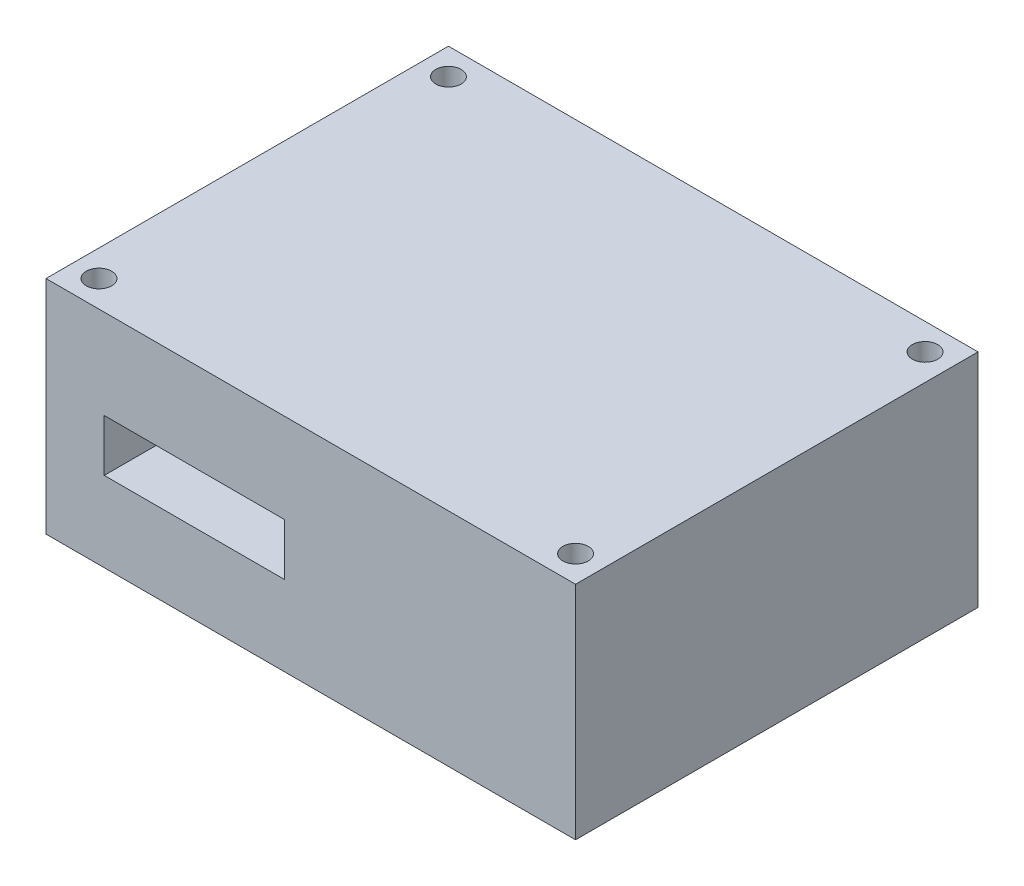
ISO-10303-21;
HEADER;
FILE_DESCRIPTION(('STEP AP214'),'2;1');
FILE_NAME('part.step','',(''),(''),'','','');
FILE_SCHEMA(('AUTOMOTIVE_DESIGN { 1 0 10303 214 1 1 1 1 }'));
ENDSEC;
DATA;
#1=APPLICATION_CONTEXT('core data for automotive mechanical design processes');
#2=APPLICATION_PROTOCOL_DEFINITION('international standard','automotive_design',2000,#1);
#3=PRODUCT_CONTEXT('',#1,'mechanical');
#4=PRODUCT('Part','Part','',(#3));
#5=PRODUCT_RELATED_PRODUCT_CATEGORY('part','',(#4));
#6=PRODUCT_DEFINITION_FORMATION('','',#4);
#7=PRODUCT_DEFINITION_CONTEXT('part definition',#1,'design');
#8=PRODUCT_DEFINITION('design','',#6,#7);
#9=PRODUCT_DEFINITION_SHAPE('','',#8);
#10=(LENGTH_UNIT() NAMED_UNIT(*) SI_UNIT(.MILLI.,.METRE.));
#11=(NAMED_UNIT(*) PLANE_ANGLE_UNIT() SI_UNIT($,.RADIAN.));
#12=(NAMED_UNIT(*) SI_UNIT($,.STERADIAN.) SOLID_ANGLE_UNIT());
#13=UNCERTAINTY_MEASURE_WITH_UNIT(LENGTH_MEASURE(1.E-05),#10,'distance_accuracy_value','');
#14=(GEOMETRIC_REPRESENTATION_CONTEXT(3) GLOBAL_UNCERTAINTY_ASSIGNED_CONTEXT((#13)) GLOBAL_UNIT_ASSIGNED_CONTEXT((#10,
#11,#12)) REPRESENTATION_CONTEXT('',''));
#15=CARTESIAN_POINT('',(0.,0.,0.));
#16=DIRECTION('',(0.,0.,1.));
#17=DIRECTION('',(1.,0.,0.));
#18=AXIS2_PLACEMENT_3D('',#15,#16,#17);
#19=CARTESIAN_POINT('',(-26.2584269662921,20.9,-16.1179775280899));
#20=DIRECTION('',(1.,0.,0.));
#21=DIRECTION('',(0.,0.,-1.));
#22=AXIS2_PLACEMENT_3D('',#19,#20,#21);
#23=PLANE('',#22);
#24=DIRECTION('',(0.,0.,1.));
#25=VECTOR('',#24,1.);
#26=CARTESIAN_POINT('',(-26.2584269662921,0.,-16.1179775280899));
#27=LINE('',#26,#25);
#28=CARTESIAN_POINT('',(-26.2584269662921,0.,-16.1179775280899));
#29=VERTEX_POINT('',#28);
#30=CARTESIAN_POINT('',(-26.2584269662921,0.,21.8820224719101));
#31=VERTEX_POINT('',#30);
#32=EDGE_CURVE('E215',#29,#31,#27,.T.);
#33=ORIENTED_EDGE('',*,*,#32,.T.);
#34=DIRECTION('',(0.,-1.,0.));
#35=VECTOR('',#34,1.);
#36=CARTESIAN_POINT('',(-26.2584269662921,20.9,21.8820224719101));
#37=LINE('',#36,#35);
#38=CARTESIAN_POINT('',(-26.2584269662921,20.9,21.8820224719101));
#39=VERTEX_POINT('',#38);
#40=EDGE_CURVE('E11',#39,#31,#37,.T.);
#41=ORIENTED_EDGE('',*,*,#40,.F.);
#42=DIRECTION('',(0.,0.,1.));
#43=VECTOR('',#42,1.);
#44=CARTESIAN_POINT('',(-26.2584269662921,20.9,-16.1179775280899));
#45=LINE('',#44,#43);
#46=CARTESIAN_POINT('',(-26.2584269662921,20.9,-16.1179775280899));
#47=VERTEX_POINT('',#46);
#48=EDGE_CURVE('E216',#47,#39,#45,.T.);
#49=ORIENTED_EDGE('',*,*,#48,.F.);
#50=DIRECTION('',(0.,-1.,0.));
#51=VECTOR('',#50,1.);
#52=CARTESIAN_POINT('',(-26.2584269662921,20.9,-16.1179775280899));
#53=LINE('',#52,#51);
#54=EDGE_CURVE('E222',#47,#29,#53,.T.);
#55=ORIENTED_EDGE('',*,*,#54,.T.);
#56=EDGE_LOOP('',(#33,#41,#49,#55));
#57=FACE_BOUND('',#56,.T.);
#58=ADVANCED_FACE('F32',(#57),#23,.F.);
#59=CARTESIAN_POINT('',(-26.2584269662921,20.9,21.8820224719101));
#60=DIRECTION('',(0.,0.,-1.));
#61=DIRECTION('',(-1.,0.,0.));
#62=AXIS2_PLACEMENT_3D('',#59,#60,#61);
#63=PLANE('',#62);
#64=DIRECTION('',(1.,0.,0.));
#65=VECTOR('',#64,1.);
#66=CARTESIAN_POINT('',(-3.75842696629214,7.55,21.8820224719101));
#67=LINE('',#66,#65);
#68=CARTESIAN_POINT('',(-20.7584269662921,7.55,21.8820224719101));
#69=VERTEX_POINT('',#68);
#70=CARTESIAN_POINT('',(-3.75842696629214,7.55,21.8820224719101));
#71=VERTEX_POINT('',#70);
#72=EDGE_CURVE('E146',#69,#71,#67,.T.);
#73=ORIENTED_EDGE('',*,*,#72,.F.);
#74=DIRECTION('',(0.,-1.,0.));
#75=VECTOR('',#74,1.);
#76=CARTESIAN_POINT('',(-20.7584269662921,7.55,21.8820224719101));
#77=LINE('',#76,#75);
#78=CARTESIAN_POINT('',(-20.7584269662921,12.45,21.8820224719101));
#79=VERTEX_POINT('',#78);
#80=EDGE_CURVE('E46',#79,#69,#77,.T.);
#81=ORIENTED_EDGE('',*,*,#80,.F.);
#82=DIRECTION('',(-1.,0.,0.));
#83=VECTOR('',#82,1.);
#84=CARTESIAN_POINT('',(-3.75842696629214,12.45,21.8820224719101));
#85=LINE('',#84,#83);
#86=CARTESIAN_POINT('',(-3.75842696629214,12.45,21.8820224719101));
#87=VERTEX_POINT('',#86);
#88=EDGE_CURVE('E137',#87,#79,#85,.T.);
#89=ORIENTED_EDGE('',*,*,#88,.F.);
#90=DIRECTION('',(0.,1.,0.));
#91=VECTOR('',#90,1.);
#92=CARTESIAN_POINT('',(-3.75842696629214,7.55,21.8820224719101));
#93=LINE('',#92,#91);
#94=EDGE_CURVE('E140',#71,#87,#93,.T.);
#95=ORIENTED_EDGE('',*,*,#94,.F.);
#96=EDGE_LOOP('',(#73,#81,#89,#95));
#97=FACE_BOUND('',#96,.T.);
#98=DIRECTION('',(1.,0.,0.));
#99=VECTOR('',#98,1.);
#100=CARTESIAN_POINT('',(-26.2584269662921,0.,21.8820224719101));
#101=LINE('',#100,#99);
#102=CARTESIAN_POINT('',(23.7415730337079,0.,21.8820224719101));
#103=VERTEX_POINT('',#102);
#104=EDGE_CURVE('E225',#31,#103,#101,.T.);
#105=ORIENTED_EDGE('',*,*,#104,.T.);
#106=DIRECTION('',(0.,-1.,0.));
#107=VECTOR('',#106,1.);
#108=CARTESIAN_POINT('',(23.7415730337079,20.9,21.8820224719101));
#109=LINE('',#108,#107);
#110=CARTESIAN_POINT('',(23.7415730337079,20.9,21.8820224719101));
#111=VERTEX_POINT('',#110);
#112=EDGE_CURVE('E39',#111,#103,#109,.T.);
#113=ORIENTED_EDGE('',*,*,#112,.F.);
#114=DIRECTION('',(1.,0.,0.));
#115=VECTOR('',#114,1.);
#116=CARTESIAN_POINT('',(-26.2584269662921,20.9,21.8820224719101));
#117=LINE('',#116,#115);
#118=EDGE_CURVE('E83',#39,#111,#117,.T.);
#119=ORIENTED_EDGE('',*,*,#118,.F.);
#120=ORIENTED_EDGE('',*,*,#40,.T.);
#121=EDGE_LOOP('',(#105,#113,#119,#120));
#122=FACE_BOUND('',#121,.T.);
#123=ADVANCED_FACE('F256',(#97,#122),#63,.F.);
#124=CARTESIAN_POINT('',(23.7415730337079,20.9,-16.1179775280899));
#125=DIRECTION('',(-1.,0.,0.));
#126=DIRECTION('',(0.,0.,1.));
#127=AXIS2_PLACEMENT_3D('',#124,#125,#126);
#128=PLANE('',#127);
#129=DIRECTION('',(0.,0.,-1.));
#130=VECTOR('',#129,1.);
#131=CARTESIAN_POINT('',(23.7415730337079,0.,-16.1179775280899));
#132=LINE('',#131,#130);
#133=CARTESIAN_POINT('',(23.7415730337079,0.,-16.1179775280899));
#134=VERTEX_POINT('',#133);
#135=EDGE_CURVE('E227',#103,#134,#132,.T.);
#136=ORIENTED_EDGE('',*,*,#135,.T.);
#137=DIRECTION('',(0.,-1.,0.));
#138=VECTOR('',#137,1.);
#139=CARTESIAN_POINT('',(23.7415730337079,20.9,-16.1179775280899));
#140=LINE('',#139,#138);
#141=CARTESIAN_POINT('',(23.7415730337079,20.9,-16.1179775280899));
#142=VERTEX_POINT('',#141);
#143=EDGE_CURVE('E231',#142,#134,#140,.T.);
#144=ORIENTED_EDGE('',*,*,#143,.F.);
#145=DIRECTION('',(0.,0.,-1.));
#146=VECTOR('',#145,1.);
#147=CARTESIAN_POINT('',(23.7415730337079,20.9,-16.1179775280899));
#148=LINE('',#147,#146);
#149=EDGE_CURVE('E219',#111,#142,#148,.T.);
#150=ORIENTED_EDGE('',*,*,#149,.F.);
#151=ORIENTED_EDGE('',*,*,#112,.T.);
#152=EDGE_LOOP('',(#136,#144,#150,#151));
#153=FACE_BOUND('',#152,.T.);
#154=ADVANCED_FACE('F236',(#153),#128,.F.);
#155=CARTESIAN_POINT('',(-26.2584269662921,20.9,-16.1179775280899));
#156=DIRECTION('',(0.,0.,1.));
#157=DIRECTION('',(1.,0.,0.));
#158=AXIS2_PLACEMENT_3D('',#155,#156,#157);
#159=PLANE('',#158);
#160=CARTESIAN_POINT('',(-20.2584269662921,2.45,-16.1179775280899));
#161=DIRECTION('',(0.,0.,-1.));
#162=DIRECTION('',(-1.,0.,0.));
#163=AXIS2_PLACEMENT_3D('',#160,#161,#162);
#164=CIRCLE('',#163,1.25);
#165=CARTESIAN_POINT('',(-21.5084269662921,2.45,-16.1179775280899));
#166=VERTEX_POINT('',#165);
#167=EDGE_CURVE('E160',#166,#166,#164,.T.);
#168=ORIENTED_EDGE('',*,*,#167,.F.);
#169=EDGE_LOOP('',(#168));
#170=FACE_BOUND('',#169,.T.);
#171=CARTESIAN_POINT('',(-16.2584269662921,2.45,-16.1179775280899));
#172=DIRECTION('',(0.,0.,-1.));
#173=DIRECTION('',(-1.,0.,0.));
#174=AXIS2_PLACEMENT_3D('',#171,#172,#173);
#175=CIRCLE('',#174,1.25);
#176=CARTESIAN_POINT('',(-17.5084269662921,2.45,-16.1179775280899));
#177=VERTEX_POINT('',#176);
#178=EDGE_CURVE('E166',#177,#177,#175,.T.);
#179=ORIENTED_EDGE('',*,*,#178,.F.);
#180=EDGE_LOOP('',(#179));
#181=FACE_BOUND('',#180,.T.);
#182=CARTESIAN_POINT('',(-12.2584269662921,2.45,-16.1179775280899));
#183=DIRECTION('',(0.,0.,-1.));
#184=DIRECTION('',(-1.,0.,0.));
#185=AXIS2_PLACEMENT_3D('',#182,#183,#184);
#186=CIRCLE('',#185,1.25);
#187=CARTESIAN_POINT('',(-13.5084269662921,2.45,-16.1179775280899));
#188=VERTEX_POINT('',#187);
#189=EDGE_CURVE('E172',#188,#188,#186,.T.);
#190=ORIENTED_EDGE('',*,*,#189,.F.);
#191=EDGE_LOOP('',(#190));
#192=FACE_BOUND('',#191,.T.);
#193=CARTESIAN_POINT('',(-8.25842696629214,2.45,-16.1179775280899));
#194=DIRECTION('',(0.,0.,-1.));
#195=DIRECTION('',(-1.,0.,0.));
#196=AXIS2_PLACEMENT_3D('',#193,#194,#195);
#197=CIRCLE('',#196,1.25);
#198=CARTESIAN_POINT('',(-9.50842696629214,2.45,-16.1179775280899));
#199=VERTEX_POINT('',#198);
#200=EDGE_CURVE('E152',#199,#199,#197,.T.);
#201=ORIENTED_EDGE('',*,*,#200,.F.);
#202=EDGE_LOOP('',(#201));
#203=FACE_BOUND('',#202,.T.);
#204=CARTESIAN_POINT('',(9.54157303370786,10.45,-16.1179775280899));
#205=DIRECTION('',(0.,0.,-1.));
#206=DIRECTION('',(-1.,0.,0.));
#207=AXIS2_PLACEMENT_3D('',#204,#205,#206);
#208=CIRCLE('',#207,9.);
#209=CARTESIAN_POINT('',(0.541573033707858,10.45,-16.1179775280899));
#210=VERTEX_POINT('',#209);
#211=EDGE_CURVE('E183',#210,#210,#208,.T.);
#212=ORIENTED_EDGE('',*,*,#211,.F.);
#213=EDGE_LOOP('',(#212));
#214=FACE_BOUND('',#213,.T.);
#215=DIRECTION('',(-1.,0.,0.));
#216=VECTOR('',#215,1.);
#217=CARTESIAN_POINT('',(-26.2584269662921,0.,-16.1179775280899));
#218=LINE('',#217,#216);
#219=EDGE_CURVE('E76',#134,#29,#218,.T.);
#220=ORIENTED_EDGE('',*,*,#219,.T.);
#221=ORIENTED_EDGE('',*,*,#54,.F.);
#222=DIRECTION('',(-1.,0.,0.));
#223=VECTOR('',#222,1.);
#224=CARTESIAN_POINT('',(-26.2584269662921,20.9,-16.1179775280899));
#225=LINE('',#224,#223);
#226=EDGE_CURVE('E55',#142,#47,#225,.T.);
#227=ORIENTED_EDGE('',*,*,#226,.F.);
#228=ORIENTED_EDGE('',*,*,#143,.T.);
#229=EDGE_LOOP('',(#220,#221,#227,#228));
#230=FACE_BOUND('',#229,.T.);
#231=ADVANCED_FACE('F244',(#170,#181,#192,#203,#214,#230),#159,.F.);
#232=CARTESIAN_POINT('',(0.,20.9,0.));
#233=DIRECTION('',(0.,1.,0.));
#234=DIRECTION('',(0.,0.,1.));
#235=AXIS2_PLACEMENT_3D('',#232,#233,#234);
#236=PLANE('',#235);
#237=CARTESIAN_POINT('',(-23.7584269662921,20.9,-13.6179775280899));
#238=DIRECTION('',(0.,1.,0.));
#239=DIRECTION('',(0.,0.,1.));
#240=AXIS2_PLACEMENT_3D('',#237,#238,#239);
#241=CIRCLE('',#240,1.19999999999999);
#242=CARTESIAN_POINT('',(-23.7584269662921,20.9,-12.4179775280899));
#243=VERTEX_POINT('',#242);
#244=EDGE_CURVE('E189',#243,#243,#241,.T.);
#245=ORIENTED_EDGE('',*,*,#244,.F.);
#246=EDGE_LOOP('',(#245));
#247=FACE_BOUND('',#246,.T.);
#248=CARTESIAN_POINT('',(-23.7584269662921,20.9,19.3820224719101));
#249=DIRECTION('',(0.,1.,0.));
#250=DIRECTION('',(0.,0.,1.));
#251=AXIS2_PLACEMENT_3D('',#248,#249,#250);
#252=CIRCLE('',#251,1.19999999999999);
#253=CARTESIAN_POINT('',(-23.7584269662921,20.9,20.5820224719101));
#254=VERTEX_POINT('',#253);
#255=EDGE_CURVE('E197',#254,#254,#252,.T.);
#256=ORIENTED_EDGE('',*,*,#255,.F.);
#257=EDGE_LOOP('',(#256));
#258=FACE_BOUND('',#257,.T.);
#259=CARTESIAN_POINT('',(21.2415730337079,20.9,19.3820224719101));
#260=DIRECTION('',(0.,1.,0.));
#261=DIRECTION('',(0.,0.,1.));
#262=AXIS2_PLACEMENT_3D('',#259,#260,#261);
#263=CIRCLE('',#262,1.19999999999999);
#264=CARTESIAN_POINT('',(21.2415730337079,20.9,20.5820224719101));
#265=VERTEX_POINT('',#264);
#266=EDGE_CURVE('E203',#265,#265,#263,.T.);
#267=ORIENTED_EDGE('',*,*,#266,.F.);
#268=EDGE_LOOP('',(#267));
#269=FACE_BOUND('',#268,.T.);
#270=CARTESIAN_POINT('',(21.2415730337079,20.9,-13.6179775280899));
#271=DIRECTION('',(0.,1.,0.));
#272=DIRECTION('',(0.,0.,1.));
#273=AXIS2_PLACEMENT_3D('',#270,#271,#272);
#274=CIRCLE('',#273,1.19999999999999);
#275=CARTESIAN_POINT('',(21.2415730337079,20.9,-12.4179775280899));
#276=VERTEX_POINT('',#275);
#277=EDGE_CURVE('E209',#276,#276,#274,.T.);
#278=ORIENTED_EDGE('',*,*,#277,.F.);
#279=EDGE_LOOP('',(#278));
#280=FACE_BOUND('',#279,.T.);
#281=ORIENTED_EDGE('',*,*,#48,.T.);
#282=ORIENTED_EDGE('',*,*,#118,.T.);
#283=ORIENTED_EDGE('',*,*,#149,.T.);
#284=ORIENTED_EDGE('',*,*,#226,.T.);
#285=EDGE_LOOP('',(#281,#282,#283,#284));
#286=FACE_BOUND('',#285,.T.);
#287=ADVANCED_FACE('F246',(#247,#258,#269,#280,#286),#236,.T.);
#288=CARTESIAN_POINT('',(0.,0.,0.));
#289=DIRECTION('',(0.,1.,0.));
#290=DIRECTION('',(0.,0.,1.));
#291=AXIS2_PLACEMENT_3D('',#288,#289,#290);
#292=PLANE('',#291);
#293=ORIENTED_EDGE('',*,*,#32,.F.);
#294=ORIENTED_EDGE('',*,*,#219,.F.);
#295=ORIENTED_EDGE('',*,*,#135,.F.);
#296=ORIENTED_EDGE('',*,*,#104,.F.);
#297=EDGE_LOOP('',(#293,#294,#295,#296));
#298=FACE_BOUND('',#297,.T.);
#299=ADVANCED_FACE('F240',(#298),#292,.F.);
#300=CARTESIAN_POINT('',(21.2415730337079,10.9,-13.6179775280899));
#301=DIRECTION('',(0.,1.,0.));
#302=DIRECTION('',(0.,0.,1.));
#303=AXIS2_PLACEMENT_3D('',#300,#301,#302);
#304=CONICAL_SURFACE('',#303,1.2,1.02974425867665);
#305=CARTESIAN_POINT('',(21.2415730337079,10.1789672571669,-13.6179775280899));
#306=VERTEX_POINT('',#305);
#307=VERTEX_LOOP('',#306);
#308=FACE_BOUND('',#307,.T.);
#309=CARTESIAN_POINT('',(21.2415730337079,10.9,-13.6179775280899));
#310=DIRECTION('',(0.,1.,0.));
#311=DIRECTION('',(0.,0.,1.));
#312=AXIS2_PLACEMENT_3D('',#309,#310,#311);
#313=CIRCLE('',#312,1.2);
#314=CARTESIAN_POINT('',(21.2415730337079,10.9,-12.4179775280899));
#315=VERTEX_POINT('',#314);
#316=EDGE_CURVE('E212',#315,#315,#313,.T.);
#317=ORIENTED_EDGE('',*,*,#316,.T.);
#318=EDGE_LOOP('',(#317));
#319=FACE_BOUND('',#318,.T.);
#320=ADVANCED_FACE('F359',(#308,#319),#304,.F.);
#321=CARTESIAN_POINT('',(21.2415730337079,20.9,-13.6179775280899));
#322=DIRECTION('',(0.,1.,0.));
#323=DIRECTION('',(0.,0.,1.));
#324=AXIS2_PLACEMENT_3D('',#321,#322,#323);
#325=CYLINDRICAL_SURFACE('',#324,1.19999999999999);
#326=ORIENTED_EDGE('',*,*,#316,.F.);
#327=EDGE_LOOP('',(#326));
#328=FACE_BOUND('',#327,.T.);
#329=ORIENTED_EDGE('',*,*,#277,.T.);
#330=EDGE_LOOP('',(#329));
#331=FACE_BOUND('',#330,.T.);
#332=ADVANCED_FACE('F355',(#328,#331),#325,.F.);
#333=CARTESIAN_POINT('',(21.2415730337079,10.9,19.3820224719101));
#334=DIRECTION('',(0.,1.,0.));
#335=DIRECTION('',(0.,0.,1.));
#336=AXIS2_PLACEMENT_3D('',#333,#334,#335);
#337=CONICAL_SURFACE('',#336,1.2,1.02974425867665);
#338=CARTESIAN_POINT('',(21.2415730337079,10.1789672571669,19.3820224719101));
#339=VERTEX_POINT('',#338);
#340=VERTEX_LOOP('',#339);
#341=FACE_BOUND('',#340,.T.);
#342=CARTESIAN_POINT('',(21.2415730337079,10.9,19.3820224719101));
#343=DIRECTION('',(0.,1.,0.));
#344=DIRECTION('',(0.,0.,1.));
#345=AXIS2_PLACEMENT_3D('',#342,#343,#344);
#346=CIRCLE('',#345,1.2);
#347=CARTESIAN_POINT('',(21.2415730337079,10.9,20.5820224719101));
#348=VERTEX_POINT('',#347);
#349=EDGE_CURVE('E206',#348,#348,#346,.T.);
#350=ORIENTED_EDGE('',*,*,#349,.T.);
#351=EDGE_LOOP('',(#350));
#352=FACE_BOUND('',#351,.T.);
#353=ADVANCED_FACE('F351',(#341,#352),#337,.F.);
#354=CARTESIAN_POINT('',(21.2415730337079,20.9,19.3820224719101));
#355=DIRECTION('',(0.,1.,0.));
#356=DIRECTION('',(0.,0.,1.));
#357=AXIS2_PLACEMENT_3D('',#354,#355,#356);
#358=CYLINDRICAL_SURFACE('',#357,1.19999999999999);
#359=ORIENTED_EDGE('',*,*,#349,.F.);
#360=EDGE_LOOP('',(#359));
#361=FACE_BOUND('',#360,.T.);
#362=ORIENTED_EDGE('',*,*,#266,.T.);
#363=EDGE_LOOP('',(#362));
#364=FACE_BOUND('',#363,.T.);
#365=ADVANCED_FACE('F347',(#361,#364),#358,.F.);
#366=CARTESIAN_POINT('',(-23.7584269662921,10.9,19.3820224719101));
#367=DIRECTION('',(0.,1.,0.));
#368=DIRECTION('',(0.,0.,1.));
#369=AXIS2_PLACEMENT_3D('',#366,#367,#368);
#370=CONICAL_SURFACE('',#369,1.2,1.02974425867665);
#371=CARTESIAN_POINT('',(-23.7584269662921,10.1789672571669,19.3820224719101));
#372=VERTEX_POINT('',#371);
#373=VERTEX_LOOP('',#372);
#374=FACE_BOUND('',#373,.T.);
#375=CARTESIAN_POINT('',(-23.7584269662921,10.9,19.3820224719101));
#376=DIRECTION('',(0.,1.,0.));
#377=DIRECTION('',(0.,0.,1.));
#378=AXIS2_PLACEMENT_3D('',#375,#376,#377);
#379=CIRCLE('',#378,1.2);
#380=CARTESIAN_POINT('',(-23.7584269662921,10.9,20.5820224719101));
#381=VERTEX_POINT('',#380);
#382=EDGE_CURVE('E200',#381,#381,#379,.T.);
#383=ORIENTED_EDGE('',*,*,#382,.T.);
#384=EDGE_LOOP('',(#383));
#385=FACE_BOUND('',#384,.T.);
#386=ADVANCED_FACE('F343',(#374,#385),#370,.F.);
#387=CARTESIAN_POINT('',(-23.7584269662921,20.9,19.3820224719101));
#388=DIRECTION('',(0.,1.,0.));
#389=DIRECTION('',(0.,0.,1.));
#390=AXIS2_PLACEMENT_3D('',#387,#388,#389);
#391=CYLINDRICAL_SURFACE('',#390,1.19999999999999);
#392=ORIENTED_EDGE('',*,*,#382,.F.);
#393=EDGE_LOOP('',(#392));
#394=FACE_BOUND('',#393,.T.);
#395=ORIENTED_EDGE('',*,*,#255,.T.);
#396=EDGE_LOOP('',(#395));
#397=FACE_BOUND('',#396,.T.);
#398=ADVANCED_FACE('F339',(#394,#397),#391,.F.);
#399=CARTESIAN_POINT('',(-23.7584269662921,10.9,-13.6179775280899));
#400=DIRECTION('',(0.,1.,0.));
#401=DIRECTION('',(0.,0.,1.));
#402=AXIS2_PLACEMENT_3D('',#399,#400,#401);
#403=CONICAL_SURFACE('',#402,1.2,1.02974425867665);
#404=CARTESIAN_POINT('',(-23.7584269662921,10.1789672571669,-13.6179775280899));
#405=VERTEX_POINT('',#404);
#406=VERTEX_LOOP('',#405);
#407=FACE_BOUND('',#406,.T.);
#408=CARTESIAN_POINT('',(-23.7584269662921,10.9,-13.6179775280899));
#409=DIRECTION('',(0.,1.,0.));
#410=DIRECTION('',(0.,0.,1.));
#411=AXIS2_PLACEMENT_3D('',#408,#409,#410);
#412=CIRCLE('',#411,1.2);
#413=CARTESIAN_POINT('',(-23.7584269662921,10.9,-12.4179775280899));
#414=VERTEX_POINT('',#413);
#415=EDGE_CURVE('E194',#414,#414,#412,.T.);
#416=ORIENTED_EDGE('',*,*,#415,.T.);
#417=EDGE_LOOP('',(#416));
#418=FACE_BOUND('',#417,.T.);
#419=ADVANCED_FACE('F335',(#407,#418),#403,.F.);
#420=CARTESIAN_POINT('',(-23.7584269662921,20.9,-13.6179775280899));
#421=DIRECTION('',(0.,1.,0.));
#422=DIRECTION('',(0.,0.,1.));
#423=AXIS2_PLACEMENT_3D('',#420,#421,#422);
#424=CYLINDRICAL_SURFACE('',#423,1.19999999999999);
#425=ORIENTED_EDGE('',*,*,#415,.F.);
#426=EDGE_LOOP('',(#425));
#427=FACE_BOUND('',#426,.T.);
#428=ORIENTED_EDGE('',*,*,#244,.T.);
#429=EDGE_LOOP('',(#428));
#430=FACE_BOUND('',#429,.T.);
#431=ADVANCED_FACE('F331',(#427,#430),#424,.F.);
#432=CARTESIAN_POINT('',(9.54157303370786,10.45,-11.1179775280899));
#433=DIRECTION('',(0.,0.,-1.));
#434=DIRECTION('',(-1.,0.,0.));
#435=AXIS2_PLACEMENT_3D('',#432,#433,#434);
#436=CYLINDRICAL_SURFACE('',#435,9.);
#437=CARTESIAN_POINT('',(9.54157303370786,10.45,-11.1179775280899));
#438=DIRECTION('',(0.,0.,-1.));
#439=DIRECTION('',(-1.,0.,0.));
#440=AXIS2_PLACEMENT_3D('',#437,#438,#439);
#441=CIRCLE('',#440,9.);
#442=CARTESIAN_POINT('',(0.541573033707858,10.45,-11.1179775280899));
#443=VERTEX_POINT('',#442);
#444=EDGE_CURVE('E186',#443,#443,#441,.T.);
#445=ORIENTED_EDGE('',*,*,#444,.F.);
#446=EDGE_LOOP('',(#445));
#447=FACE_BOUND('',#446,.T.);
#448=ORIENTED_EDGE('',*,*,#211,.T.);
#449=EDGE_LOOP('',(#448));
#450=FACE_BOUND('',#449,.T.);
#451=ADVANCED_FACE('F327',(#447,#450),#436,.F.);
#452=CARTESIAN_POINT('',(9.54157303370786,10.45,-11.1179775280899));
#453=DIRECTION('',(0.,0.,-1.));
#454=DIRECTION('',(-1.,0.,0.));
#455=AXIS2_PLACEMENT_3D('',#452,#453,#454);
#456=PLANE('',#455);
#457=CARTESIAN_POINT('',(9.54157303370786,10.45,-11.1179775280899));
#458=DIRECTION('',(0.,0.,-1.));
#459=DIRECTION('',(-1.,0.,0.));
#460=AXIS2_PLACEMENT_3D('',#457,#458,#459);
#461=CIRCLE('',#460,6.);
#462=CARTESIAN_POINT('',(3.54157303370786,10.45,-11.1179775280899));
#463=VERTEX_POINT('',#462);
#464=EDGE_CURVE('E180',#463,#463,#461,.T.);
#465=ORIENTED_EDGE('',*,*,#464,.F.);
#466=EDGE_LOOP('',(#465));
#467=FACE_BOUND('',#466,.T.);
#468=ORIENTED_EDGE('',*,*,#444,.T.);
#469=EDGE_LOOP('',(#468));
#470=FACE_BOUND('',#469,.T.);
#471=ADVANCED_FACE('F323',(#467,#470),#456,.T.);
#472=CARTESIAN_POINT('',(9.54157303370786,10.45,-11.1179775280899));
#473=DIRECTION('',(0.,0.,-1.));
#474=DIRECTION('',(-1.,0.,0.));
#475=AXIS2_PLACEMENT_3D('',#472,#473,#474);
#476=CYLINDRICAL_SURFACE('',#475,6.);
#477=ORIENTED_EDGE('',*,*,#464,.T.);
#478=EDGE_LOOP('',(#477));
#479=FACE_BOUND('',#478,.T.);
#480=CARTESIAN_POINT('',(9.54157303370786,10.45,-16.1179775280899));
#481=DIRECTION('',(0.,0.,-1.));
#482=DIRECTION('',(-1.,0.,0.));
#483=AXIS2_PLACEMENT_3D('',#480,#481,#482);
#484=CIRCLE('',#483,6.);
#485=CARTESIAN_POINT('',(3.54157303370786,10.45,-16.1179775280899));
#486=VERTEX_POINT('',#485);
#487=EDGE_CURVE('E159',#486,#486,#484,.T.);
#488=ORIENTED_EDGE('',*,*,#487,.F.);
#489=EDGE_LOOP('',(#488));
#490=FACE_BOUND('',#489,.T.);
#491=ADVANCED_FACE('F263',(#479,#490),#476,.T.);
#492=ORIENTED_EDGE('',*,*,#487,.T.);
#493=EDGE_LOOP('',(#492));
#494=FACE_BOUND('',#493,.T.);
#495=ADVANCED_FACE('F249',(#494),#159,.F.);
#496=CARTESIAN_POINT('',(-8.25842696629214,2.45,-11.1179775280899));
#497=DIRECTION('',(0.,0.,-1.));
#498=DIRECTION('',(-1.,0.,0.));
#499=AXIS2_PLACEMENT_3D('',#496,#497,#498);
#500=CYLINDRICAL_SURFACE('',#499,1.25);
#501=CARTESIAN_POINT('',(-8.25842696629214,2.45,-11.1179775280899));
#502=DIRECTION('',(0.,0.,-1.));
#503=DIRECTION('',(-1.,0.,0.));
#504=AXIS2_PLACEMENT_3D('',#501,#502,#503);
#505=CIRCLE('',#504,1.25);
#506=CARTESIAN_POINT('',(-9.50842696629214,2.45,-11.1179775280899));
#507=VERTEX_POINT('',#506);
#508=EDGE_CURVE('E175',#507,#507,#505,.T.);
#509=ORIENTED_EDGE('',*,*,#508,.F.);
#510=EDGE_LOOP('',(#509));
#511=FACE_BOUND('',#510,.T.);
#512=ORIENTED_EDGE('',*,*,#200,.T.);
#513=EDGE_LOOP('',(#512));
#514=FACE_BOUND('',#513,.T.);
#515=ADVANCED_FACE('F262',(#511,#514),#500,.F.);
#516=CARTESIAN_POINT('',(-8.25842696629214,2.45,-11.1179775280899));
#517=DIRECTION('',(0.,0.,-1.));
#518=DIRECTION('',(-1.,0.,0.));
#519=AXIS2_PLACEMENT_3D('',#516,#517,#518);
#520=PLANE('',#519);
#521=ORIENTED_EDGE('',*,*,#508,.T.);
#522=EDGE_LOOP('',(#521));
#523=FACE_BOUND('',#522,.T.);
#524=ADVANCED_FACE('F313',(#523),#520,.T.);
#525=CARTESIAN_POINT('',(-12.2584269662921,2.45,-11.1179775280899));
#526=DIRECTION('',(0.,0.,-1.));
#527=DIRECTION('',(-1.,0.,0.));
#528=AXIS2_PLACEMENT_3D('',#525,#526,#527);
#529=CYLINDRICAL_SURFACE('',#528,1.25);
#530=CARTESIAN_POINT('',(-12.2584269662921,2.45,-11.1179775280899));
#531=DIRECTION('',(0.,0.,-1.));
#532=DIRECTION('',(-1.,0.,0.));
#533=AXIS2_PLACEMENT_3D('',#530,#531,#532);
#534=CIRCLE('',#533,1.25);
#535=CARTESIAN_POINT('',(-13.5084269662921,2.45,-11.1179775280899));
#536=VERTEX_POINT('',#535);
#537=EDGE_CURVE('E169',#536,#536,#534,.T.);
#538=ORIENTED_EDGE('',*,*,#537,.F.);
#539=EDGE_LOOP('',(#538));
#540=FACE_BOUND('',#539,.T.);
#541=ORIENTED_EDGE('',*,*,#189,.T.);
#542=EDGE_LOOP('',(#541));
#543=FACE_BOUND('',#542,.T.);
#544=ADVANCED_FACE('F309',(#540,#543),#529,.F.);
#545=CARTESIAN_POINT('',(-12.2584269662921,2.45,-11.1179775280899));
#546=DIRECTION('',(0.,0.,-1.));
#547=DIRECTION('',(-1.,0.,0.));
#548=AXIS2_PLACEMENT_3D('',#545,#546,#547);
#549=PLANE('',#548);
#550=ORIENTED_EDGE('',*,*,#537,.T.);
#551=EDGE_LOOP('',(#550));
#552=FACE_BOUND('',#551,.T.);
#553=ADVANCED_FACE('F305',(#552),#549,.T.);
#554=CARTESIAN_POINT('',(-16.2584269662921,2.45,-11.1179775280899));
#555=DIRECTION('',(0.,0.,-1.));
#556=DIRECTION('',(-1.,0.,0.));
#557=AXIS2_PLACEMENT_3D('',#554,#555,#556);
#558=CYLINDRICAL_SURFACE('',#557,1.25);
#559=CARTESIAN_POINT('',(-16.2584269662921,2.45,-11.1179775280899));
#560=DIRECTION('',(0.,0.,-1.));
#561=DIRECTION('',(-1.,0.,0.));
#562=AXIS2_PLACEMENT_3D('',#559,#560,#561);
#563=CIRCLE('',#562,1.25);
#564=CARTESIAN_POINT('',(-17.5084269662921,2.45,-11.1179775280899));
#565=VERTEX_POINT('',#564);
#566=EDGE_CURVE('E163',#565,#565,#563,.T.);
#567=ORIENTED_EDGE('',*,*,#566,.F.);
#568=EDGE_LOOP('',(#567));
#569=FACE_BOUND('',#568,.T.);
#570=ORIENTED_EDGE('',*,*,#178,.T.);
#571=EDGE_LOOP('',(#570));
#572=FACE_BOUND('',#571,.T.);
#573=ADVANCED_FACE('F301',(#569,#572),#558,.F.);
#574=CARTESIAN_POINT('',(-16.2584269662921,2.45,-11.1179775280899));
#575=DIRECTION('',(0.,0.,-1.));
#576=DIRECTION('',(-1.,0.,0.));
#577=AXIS2_PLACEMENT_3D('',#574,#575,#576);
#578=PLANE('',#577);
#579=ORIENTED_EDGE('',*,*,#566,.T.);
#580=EDGE_LOOP('',(#579));
#581=FACE_BOUND('',#580,.T.);
#582=ADVANCED_FACE('F297',(#581),#578,.T.);
#583=CARTESIAN_POINT('',(-20.2584269662921,2.45,-11.1179775280899));
#584=DIRECTION('',(0.,0.,-1.));
#585=DIRECTION('',(-1.,0.,0.));
#586=AXIS2_PLACEMENT_3D('',#583,#584,#585);
#587=CYLINDRICAL_SURFACE('',#586,1.25);
#588=CARTESIAN_POINT('',(-20.2584269662921,2.45,-11.1179775280899));
#589=DIRECTION('',(0.,0.,-1.));
#590=DIRECTION('',(-1.,0.,0.));
#591=AXIS2_PLACEMENT_3D('',#588,#589,#590);
#592=CIRCLE('',#591,1.25);
#593=CARTESIAN_POINT('',(-21.5084269662921,2.45,-11.1179775280899));
#594=VERTEX_POINT('',#593);
#595=EDGE_CURVE('E156',#594,#594,#592,.T.);
#596=ORIENTED_EDGE('',*,*,#595,.F.);
#597=EDGE_LOOP('',(#596));
#598=FACE_BOUND('',#597,.T.);
#599=ORIENTED_EDGE('',*,*,#167,.T.);
#600=EDGE_LOOP('',(#599));
#601=FACE_BOUND('',#600,.T.);
#602=ADVANCED_FACE('F293',(#598,#601),#587,.F.);
#603=CARTESIAN_POINT('',(-20.2584269662921,2.45,-11.1179775280899));
#604=DIRECTION('',(0.,0.,-1.));
#605=DIRECTION('',(-1.,0.,0.));
#606=AXIS2_PLACEMENT_3D('',#603,#604,#605);
#607=PLANE('',#606);
#608=ORIENTED_EDGE('',*,*,#595,.T.);
#609=EDGE_LOOP('',(#608));
#610=FACE_BOUND('',#609,.T.);
#611=ADVANCED_FACE('F285',(#610),#607,.T.);
#612=CARTESIAN_POINT('',(-20.7584269662921,7.55,16.8820224719101));
#613=DIRECTION('',(-1.,0.,0.));
#614=DIRECTION('',(0.,0.,1.));
#615=AXIS2_PLACEMENT_3D('',#612,#613,#614);
#616=PLANE('',#615);
#617=ORIENTED_EDGE('',*,*,#80,.T.);
#618=DIRECTION('',(0.,0.,1.));
#619=VECTOR('',#618,1.);
#620=CARTESIAN_POINT('',(-20.7584269662921,7.55,16.8820224719101));
#621=LINE('',#620,#619);
#622=CARTESIAN_POINT('',(-20.7584269662921,7.55,16.8820224719101));
#623=VERTEX_POINT('',#622);
#624=EDGE_CURVE('E115',#623,#69,#621,.T.);
#625=ORIENTED_EDGE('',*,*,#624,.F.);
#626=DIRECTION('',(0.,-1.,0.));
#627=VECTOR('',#626,1.);
#628=CARTESIAN_POINT('',(-20.7584269662921,7.55,16.8820224719101));
#629=LINE('',#628,#627);
#630=CARTESIAN_POINT('',(-20.7584269662921,12.45,16.8820224719101));
#631=VERTEX_POINT('',#630);
#632=EDGE_CURVE('E119',#631,#623,#629,.T.);
#633=ORIENTED_EDGE('',*,*,#632,.F.);
#634=DIRECTION('',(0.,0.,1.));
#635=VECTOR('',#634,1.);
#636=CARTESIAN_POINT('',(-20.7584269662921,12.45,16.8820224719101));
#637=LINE('',#636,#635);
#638=EDGE_CURVE('E150',#631,#79,#637,.T.);
#639=ORIENTED_EDGE('',*,*,#638,.T.);
#640=EDGE_LOOP('',(#617,#625,#633,#639));
#641=FACE_BOUND('',#640,.T.);
#642=ADVANCED_FACE('F117',(#641),#616,.F.);
#643=CARTESIAN_POINT('',(-3.75842696629214,12.45,16.8820224719101));
#644=DIRECTION('',(0.,1.,0.));
#645=DIRECTION('',(-1.,0.,0.));
#646=AXIS2_PLACEMENT_3D('',#643,#644,#645);
#647=PLANE('',#646);
#648=ORIENTED_EDGE('',*,*,#88,.T.);
#649=ORIENTED_EDGE('',*,*,#638,.F.);
#650=DIRECTION('',(-1.,0.,0.));
#651=VECTOR('',#650,1.);
#652=CARTESIAN_POINT('',(-3.75842696629214,12.45,16.8820224719101));
#653=LINE('',#652,#651);
#654=CARTESIAN_POINT('',(-3.75842696629214,12.45,16.8820224719101));
#655=VERTEX_POINT('',#654);
#656=EDGE_CURVE('E125',#655,#631,#653,.T.);
#657=ORIENTED_EDGE('',*,*,#656,.F.);
#658=DIRECTION('',(0.,0.,1.));
#659=VECTOR('',#658,1.);
#660=CARTESIAN_POINT('',(-3.75842696629214,12.45,16.8820224719101));
#661=LINE('',#660,#659);
#662=EDGE_CURVE('E153',#655,#87,#661,.T.);
#663=ORIENTED_EDGE('',*,*,#662,.T.);
#664=EDGE_LOOP('',(#648,#649,#657,#663));
#665=FACE_BOUND('',#664,.T.);
#666=ADVANCED_FACE('F277',(#665),#647,.F.);
#667=CARTESIAN_POINT('',(-3.75842696629214,7.55,16.8820224719101));
#668=DIRECTION('',(1.,0.,0.));
#669=DIRECTION('',(0.,1.,0.));
#670=AXIS2_PLACEMENT_3D('',#667,#668,#669);
#671=PLANE('',#670);
#672=ORIENTED_EDGE('',*,*,#94,.T.);
#673=ORIENTED_EDGE('',*,*,#662,.F.);
#674=DIRECTION('',(0.,1.,0.));
#675=VECTOR('',#674,1.);
#676=CARTESIAN_POINT('',(-3.75842696629214,7.55,16.8820224719101));
#677=LINE('',#676,#675);
#678=CARTESIAN_POINT('',(-3.75842696629214,7.55,16.8820224719101));
#679=VERTEX_POINT('',#678);
#680=EDGE_CURVE('E133',#679,#655,#677,.T.);
#681=ORIENTED_EDGE('',*,*,#680,.F.);
#682=DIRECTION('',(0.,0.,1.));
#683=VECTOR('',#682,1.);
#684=CARTESIAN_POINT('',(-3.75842696629214,7.55,16.8820224719101));
#685=LINE('',#684,#683);
#686=EDGE_CURVE('E124',#679,#71,#685,.T.);
#687=ORIENTED_EDGE('',*,*,#686,.T.);
#688=EDGE_LOOP('',(#672,#673,#681,#687));
#689=FACE_BOUND('',#688,.T.);
#690=ADVANCED_FACE('F275',(#689),#671,.F.);
#691=CARTESIAN_POINT('',(-3.75842696629214,7.55,16.8820224719101));
#692=DIRECTION('',(0.,-1.,0.));
#693=DIRECTION('',(1.,0.,0.));
#694=AXIS2_PLACEMENT_3D('',#691,#692,#693);
#695=PLANE('',#694);
#696=ORIENTED_EDGE('',*,*,#72,.T.);
#697=ORIENTED_EDGE('',*,*,#686,.F.);
#698=DIRECTION('',(1.,0.,0.));
#699=VECTOR('',#698,1.);
#700=CARTESIAN_POINT('',(-3.75842696629214,7.55,16.8820224719101));
#701=LINE('',#700,#699);
#702=EDGE_CURVE('E128',#623,#679,#701,.T.);
#703=ORIENTED_EDGE('',*,*,#702,.F.);
#704=ORIENTED_EDGE('',*,*,#624,.T.);
#705=EDGE_LOOP('',(#696,#697,#703,#704));
#706=FACE_BOUND('',#705,.T.);
#707=ADVANCED_FACE('F129',(#706),#695,.F.);
#708=CARTESIAN_POINT('',(0.,0.,16.8820224719101));
#709=DIRECTION('',(0.,0.,1.));
#710=DIRECTION('',(1.,0.,0.));
#711=AXIS2_PLACEMENT_3D('',#708,#709,#710);
#712=PLANE('',#711);
#713=ORIENTED_EDGE('',*,*,#632,.T.);
#714=ORIENTED_EDGE('',*,*,#702,.T.);
#715=ORIENTED_EDGE('',*,*,#680,.T.);
#716=ORIENTED_EDGE('',*,*,#656,.T.);
#717=EDGE_LOOP('',(#713,#714,#715,#716));
#718=FACE_BOUND('',#717,.T.);
#719=ADVANCED_FACE('F135',(#718),#712,.T.);
#720=CLOSED_SHELL('',(#58,#123,#154,#231,#287,#299,#320,#332,#353,#365,#386,#398,#419,#431,#451,
#471,#491,#495,#515,#524,#544,#553,#573,#582,#602,#611,#642,#666,#690,#707,#719));
#721=MANIFOLD_SOLID_BREP('B2',#720);
#722=ADVANCED_BREP_SHAPE_REPRESENTATION('',(#18,#721),#14);
#723=SHAPE_DEFINITION_REPRESENTATION(#9,#722);
ENDSEC;
END-ISO-10303-21;
